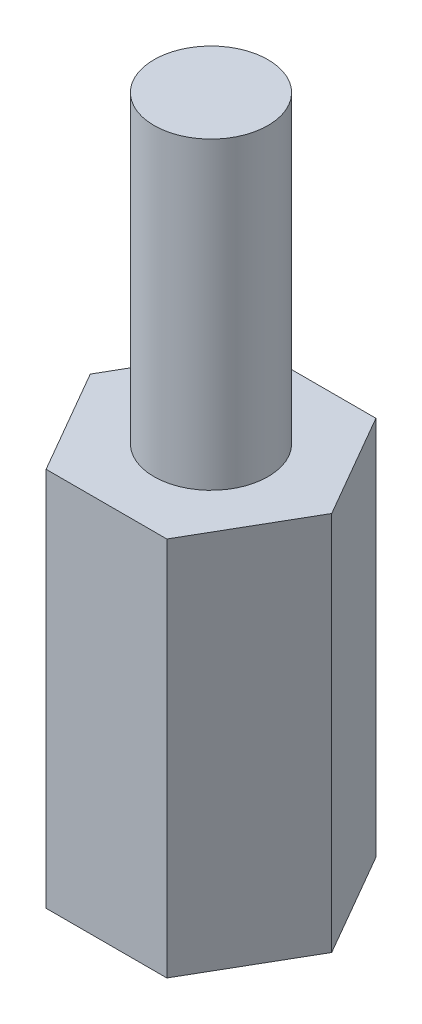
ISO-10303-21;
HEADER;
FILE_DESCRIPTION(('STEP AP214'),'2;1');
FILE_NAME('part.step','',(''),(''),'','','');
FILE_SCHEMA(('AUTOMOTIVE_DESIGN { 1 0 10303 214 1 1 1 1 }'));
ENDSEC;
DATA;
#1=APPLICATION_CONTEXT('core data for automotive mechanical design processes');
#2=APPLICATION_PROTOCOL_DEFINITION('international standard','automotive_design',2000,#1);
#3=PRODUCT_CONTEXT('',#1,'mechanical');
#4=PRODUCT('Part','Part','',(#3));
#5=PRODUCT_RELATED_PRODUCT_CATEGORY('part','',(#4));
#6=PRODUCT_DEFINITION_FORMATION('','',#4);
#7=PRODUCT_DEFINITION_CONTEXT('part definition',#1,'design');
#8=PRODUCT_DEFINITION('design','',#6,#7);
#9=PRODUCT_DEFINITION_SHAPE('','',#8);
#10=(LENGTH_UNIT() NAMED_UNIT(*) SI_UNIT(.MILLI.,.METRE.));
#11=(NAMED_UNIT(*) PLANE_ANGLE_UNIT() SI_UNIT($,.RADIAN.));
#12=(NAMED_UNIT(*) SI_UNIT($,.STERADIAN.) SOLID_ANGLE_UNIT());
#13=UNCERTAINTY_MEASURE_WITH_UNIT(LENGTH_MEASURE(1.E-05),#10,'distance_accuracy_value','');
#14=(GEOMETRIC_REPRESENTATION_CONTEXT(3) GLOBAL_UNCERTAINTY_ASSIGNED_CONTEXT((#13)) GLOBAL_UNIT_ASSIGNED_CONTEXT((#10,
#11,#12)) REPRESENTATION_CONTEXT('',''));
#15=CARTESIAN_POINT('',(0.,0.,0.));
#16=DIRECTION('',(0.,0.,1.));
#17=DIRECTION('',(1.,0.,0.));
#18=AXIS2_PLACEMENT_3D('',#15,#16,#17);
#19=CARTESIAN_POINT('',(1.5877132402715,-10.,2.74999999999998));
#20=DIRECTION('',(0.866025403784442,0.,0.499999999999995));
#21=DIRECTION('',(0.499999999999995,0.,-0.866025403784442));
#22=AXIS2_PLACEMENT_3D('',#19,#20,#21);
#23=PLANE('',#22);
#24=DIRECTION('',(0.499999999999995,0.,-0.866025403784441));
#25=VECTOR('',#24,1.);
#26=CARTESIAN_POINT('',(1.5877132402715,0.,2.74999999999998));
#27=LINE('',#26,#25);
#28=CARTESIAN_POINT('',(1.5877132402715,0.,2.74999999999998));
#29=VERTEX_POINT('',#28);
#30=CARTESIAN_POINT('',(3.17542648054294,0.,0.));
#31=VERTEX_POINT('',#30);
#32=EDGE_CURVE('E132',#29,#31,#27,.T.);
#33=ORIENTED_EDGE('',*,*,#32,.F.);
#34=DIRECTION('',(0.,1.,0.));
#35=VECTOR('',#34,1.);
#36=CARTESIAN_POINT('',(1.5877132402715,-10.,2.74999999999998));
#37=LINE('',#36,#35);
#38=CARTESIAN_POINT('',(1.5877132402715,-10.,2.74999999999998));
#39=VERTEX_POINT('',#38);
#40=EDGE_CURVE('E49',#39,#29,#37,.T.);
#41=ORIENTED_EDGE('',*,*,#40,.F.);
#42=DIRECTION('',(0.499999999999995,0.,-0.866025403784441));
#43=VECTOR('',#42,1.);
#44=CARTESIAN_POINT('',(1.5877132402715,-10.,2.74999999999998));
#45=LINE('',#44,#43);
#46=CARTESIAN_POINT('',(3.17542648054294,-10.,0.));
#47=VERTEX_POINT('',#46);
#48=EDGE_CURVE('E154',#39,#47,#45,.T.);
#49=ORIENTED_EDGE('',*,*,#48,.T.);
#50=DIRECTION('',(0.,1.,0.));
#51=VECTOR('',#50,1.);
#52=CARTESIAN_POINT('',(3.17542648054294,-10.,0.));
#53=LINE('',#52,#51);
#54=EDGE_CURVE('E42',#47,#31,#53,.T.);
#55=ORIENTED_EDGE('',*,*,#54,.T.);
#56=EDGE_LOOP('',(#33,#41,#49,#55));
#57=FACE_BOUND('',#56,.T.);
#58=ADVANCED_FACE('F39',(#57),#23,.T.);
#59=CARTESIAN_POINT('',(-1.58771324027145,-10.,2.75000000000002));
#60=DIRECTION('',(0.,0.,1.));
#61=DIRECTION('',(1.,0.,0.));
#62=AXIS2_PLACEMENT_3D('',#59,#60,#61);
#63=PLANE('',#62);
#64=DIRECTION('',(1.,0.,0.));
#65=VECTOR('',#64,1.);
#66=CARTESIAN_POINT('',(-1.58771324027145,0.,2.75000000000002));
#67=LINE('',#66,#65);
#68=CARTESIAN_POINT('',(-1.58771324027145,0.,2.75000000000002));
#69=VERTEX_POINT('',#68);
#70=EDGE_CURVE('E150',#69,#29,#67,.T.);
#71=ORIENTED_EDGE('',*,*,#70,.F.);
#72=DIRECTION('',(0.,1.,0.));
#73=VECTOR('',#72,1.);
#74=CARTESIAN_POINT('',(-1.58771324027145,-10.,2.75000000000002));
#75=LINE('',#74,#73);
#76=CARTESIAN_POINT('',(-1.58771324027145,-10.,2.75000000000002));
#77=VERTEX_POINT('',#76);
#78=EDGE_CURVE('E80',#77,#69,#75,.T.);
#79=ORIENTED_EDGE('',*,*,#78,.F.);
#80=DIRECTION('',(1.,0.,0.));
#81=VECTOR('',#80,1.);
#82=CARTESIAN_POINT('',(-1.58771324027145,-10.,2.75000000000002));
#83=LINE('',#82,#81);
#84=EDGE_CURVE('E118',#77,#39,#83,.T.);
#85=ORIENTED_EDGE('',*,*,#84,.T.);
#86=ORIENTED_EDGE('',*,*,#40,.T.);
#87=EDGE_LOOP('',(#71,#79,#85,#86));
#88=FACE_BOUND('',#87,.T.);
#89=ADVANCED_FACE('F167',(#88),#63,.T.);
#90=CARTESIAN_POINT('',(-3.17542648054294,-10.,0.));
#91=DIRECTION('',(-0.866025403784435,0.,0.500000000000007));
#92=DIRECTION('',(0.500000000000007,0.,0.866025403784435));
#93=AXIS2_PLACEMENT_3D('',#90,#91,#92);
#94=PLANE('',#93);
#95=DIRECTION('',(0.500000000000007,0.,0.866025403784435));
#96=VECTOR('',#95,1.);
#97=CARTESIAN_POINT('',(-3.17542648054294,0.,0.));
#98=LINE('',#97,#96);
#99=CARTESIAN_POINT('',(-3.17542648054294,0.,0.));
#100=VERTEX_POINT('',#99);
#101=EDGE_CURVE('E104',#100,#69,#98,.T.);
#102=ORIENTED_EDGE('',*,*,#101,.F.);
#103=DIRECTION('',(0.,1.,0.));
#104=VECTOR('',#103,1.);
#105=CARTESIAN_POINT('',(-3.17542648054294,-10.,0.));
#106=LINE('',#105,#104);
#107=CARTESIAN_POINT('',(-3.17542648054294,-10.,0.));
#108=VERTEX_POINT('',#107);
#109=EDGE_CURVE('E99',#108,#100,#106,.T.);
#110=ORIENTED_EDGE('',*,*,#109,.F.);
#111=DIRECTION('',(0.500000000000007,0.,0.866025403784435));
#112=VECTOR('',#111,1.);
#113=CARTESIAN_POINT('',(-3.17542648054294,-10.,0.));
#114=LINE('',#113,#112);
#115=EDGE_CURVE('E102',#108,#77,#114,.T.);
#116=ORIENTED_EDGE('',*,*,#115,.T.);
#117=ORIENTED_EDGE('',*,*,#78,.T.);
#118=EDGE_LOOP('',(#102,#110,#116,#117));
#119=FACE_BOUND('',#118,.T.);
#120=ADVANCED_FACE('F101',(#119),#94,.T.);
#121=CARTESIAN_POINT('',(-1.58771324027148,-10.,-2.74999999999999));
#122=DIRECTION('',(-0.866025403784442,0.,-0.499999999999995));
#123=DIRECTION('',(-0.499999999999995,0.,0.866025403784442));
#124=AXIS2_PLACEMENT_3D('',#121,#122,#123);
#125=PLANE('',#124);
#126=DIRECTION('',(-0.499999999999995,0.,0.866025403784442));
#127=VECTOR('',#126,1.);
#128=CARTESIAN_POINT('',(-1.58771324027148,0.,-2.74999999999999));
#129=LINE('',#128,#127);
#130=CARTESIAN_POINT('',(-1.58771324027148,0.,-2.74999999999999));
#131=VERTEX_POINT('',#130);
#132=EDGE_CURVE('E145',#131,#100,#129,.T.);
#133=ORIENTED_EDGE('',*,*,#132,.F.);
#134=DIRECTION('',(0.,1.,0.));
#135=VECTOR('',#134,1.);
#136=CARTESIAN_POINT('',(-1.58771324027148,-10.,-2.74999999999999));
#137=LINE('',#136,#135);
#138=CARTESIAN_POINT('',(-1.58771324027148,-10.,-2.74999999999999));
#139=VERTEX_POINT('',#138);
#140=EDGE_CURVE('E110',#139,#131,#137,.T.);
#141=ORIENTED_EDGE('',*,*,#140,.F.);
#142=DIRECTION('',(-0.499999999999995,0.,0.866025403784442));
#143=VECTOR('',#142,1.);
#144=CARTESIAN_POINT('',(-1.58771324027148,-10.,-2.74999999999999));
#145=LINE('',#144,#143);
#146=EDGE_CURVE('E116',#139,#108,#145,.T.);
#147=ORIENTED_EDGE('',*,*,#146,.T.);
#148=ORIENTED_EDGE('',*,*,#109,.T.);
#149=EDGE_LOOP('',(#133,#141,#147,#148));
#150=FACE_BOUND('',#149,.T.);
#151=ADVANCED_FACE('F121',(#150),#125,.T.);
#152=CARTESIAN_POINT('',(1.58771324027147,-10.,-2.75000000000001));
#153=DIRECTION('',(0.,0.,-1.));
#154=DIRECTION('',(-1.,0.,0.));
#155=AXIS2_PLACEMENT_3D('',#152,#153,#154);
#156=PLANE('',#155);
#157=DIRECTION('',(-1.,0.,0.));
#158=VECTOR('',#157,1.);
#159=CARTESIAN_POINT('',(1.58771324027147,0.,-2.75000000000001));
#160=LINE('',#159,#158);
#161=CARTESIAN_POINT('',(1.58771324027147,0.,-2.75000000000001));
#162=VERTEX_POINT('',#161);
#163=EDGE_CURVE('E141',#162,#131,#160,.T.);
#164=ORIENTED_EDGE('',*,*,#163,.F.);
#165=DIRECTION('',(0.,1.,0.));
#166=VECTOR('',#165,1.);
#167=CARTESIAN_POINT('',(1.58771324027147,-10.,-2.75000000000001));
#168=LINE('',#167,#166);
#169=CARTESIAN_POINT('',(1.58771324027147,-10.,-2.75000000000001));
#170=VERTEX_POINT('',#169);
#171=EDGE_CURVE('E160',#170,#162,#168,.T.);
#172=ORIENTED_EDGE('',*,*,#171,.F.);
#173=DIRECTION('',(-1.,0.,0.));
#174=VECTOR('',#173,1.);
#175=CARTESIAN_POINT('',(1.58771324027147,-10.,-2.75000000000001));
#176=LINE('',#175,#174);
#177=EDGE_CURVE('E123',#170,#139,#176,.T.);
#178=ORIENTED_EDGE('',*,*,#177,.T.);
#179=ORIENTED_EDGE('',*,*,#140,.T.);
#180=EDGE_LOOP('',(#164,#172,#178,#179));
#181=FACE_BOUND('',#180,.T.);
#182=ADVANCED_FACE('F180',(#181),#156,.T.);
#183=CARTESIAN_POINT('',(3.17542648054294,-10.,0.));
#184=DIRECTION('',(0.866025403784438,0.,-0.500000000000001));
#185=DIRECTION('',(-0.500000000000001,0.,-0.866025403784438));
#186=AXIS2_PLACEMENT_3D('',#183,#184,#185);
#187=PLANE('',#186);
#188=DIRECTION('',(-0.500000000000001,0.,-0.866025403784438));
#189=VECTOR('',#188,1.);
#190=CARTESIAN_POINT('',(3.17542648054294,0.,0.));
#191=LINE('',#190,#189);
#192=EDGE_CURVE('E136',#31,#162,#191,.T.);
#193=ORIENTED_EDGE('',*,*,#192,.F.);
#194=ORIENTED_EDGE('',*,*,#54,.F.);
#195=DIRECTION('',(-0.500000000000001,0.,-0.866025403784438));
#196=VECTOR('',#195,1.);
#197=CARTESIAN_POINT('',(3.17542648054294,-10.,0.));
#198=LINE('',#197,#196);
#199=EDGE_CURVE('E126',#47,#170,#198,.T.);
#200=ORIENTED_EDGE('',*,*,#199,.T.);
#201=ORIENTED_EDGE('',*,*,#171,.T.);
#202=EDGE_LOOP('',(#193,#194,#200,#201));
#203=FACE_BOUND('',#202,.T.);
#204=ADVANCED_FACE('F164',(#203),#187,.T.);
#205=CARTESIAN_POINT('',(0.,-10.,0.));
#206=DIRECTION('',(0.,1.,0.));
#207=DIRECTION('',(0.,0.,1.));
#208=AXIS2_PLACEMENT_3D('',#205,#206,#207);
#209=PLANE('',#208);
#210=ORIENTED_EDGE('',*,*,#48,.F.);
#211=ORIENTED_EDGE('',*,*,#84,.F.);
#212=ORIENTED_EDGE('',*,*,#115,.F.);
#213=ORIENTED_EDGE('',*,*,#146,.F.);
#214=ORIENTED_EDGE('',*,*,#177,.F.);
#215=ORIENTED_EDGE('',*,*,#199,.F.);
#216=EDGE_LOOP('',(#210,#211,#212,#213,#214,#215));
#217=FACE_BOUND('',#216,.T.);
#218=ADVANCED_FACE('F114',(#217),#209,.F.);
#219=CARTESIAN_POINT('',(0.,0.,0.));
#220=DIRECTION('',(0.,1.,0.));
#221=DIRECTION('',(0.,0.,1.));
#222=AXIS2_PLACEMENT_3D('',#219,#220,#221);
#223=PLANE('',#222);
#224=CARTESIAN_POINT('',(0.,0.,0.));
#225=DIRECTION('',(0.,1.,0.));
#226=DIRECTION('',(0.,0.,1.));
#227=AXIS2_PLACEMENT_3D('',#224,#225,#226);
#228=CIRCLE('',#227,1.5);
#229=CARTESIAN_POINT('',(0.,0.,1.5));
#230=VERTEX_POINT('',#229);
#231=EDGE_CURVE('E11',#230,#230,#228,.T.);
#232=ORIENTED_EDGE('',*,*,#231,.F.);
#233=EDGE_LOOP('',(#232));
#234=FACE_BOUND('',#233,.T.);
#235=ORIENTED_EDGE('',*,*,#32,.T.);
#236=ORIENTED_EDGE('',*,*,#192,.T.);
#237=ORIENTED_EDGE('',*,*,#163,.T.);
#238=ORIENTED_EDGE('',*,*,#132,.T.);
#239=ORIENTED_EDGE('',*,*,#101,.T.);
#240=ORIENTED_EDGE('',*,*,#70,.T.);
#241=EDGE_LOOP('',(#235,#236,#237,#238,#239,#240));
#242=FACE_BOUND('',#241,.T.);
#243=ADVANCED_FACE('F166',(#234,#242),#223,.T.);
#244=CARTESIAN_POINT('',(0.,8.,0.));
#245=DIRECTION('',(0.,-1.,0.));
#246=DIRECTION('',(0.,0.,-1.));
#247=AXIS2_PLACEMENT_3D('',#244,#245,#246);
#248=CYLINDRICAL_SURFACE('',#247,1.5);
#249=CARTESIAN_POINT('',(0.,8.,0.));
#250=DIRECTION('',(0.,1.,0.));
#251=DIRECTION('',(0.,0.,1.));
#252=AXIS2_PLACEMENT_3D('',#249,#250,#251);
#253=CIRCLE('',#252,1.5);
#254=CARTESIAN_POINT('',(0.,8.,1.5));
#255=VERTEX_POINT('',#254);
#256=EDGE_CURVE('E137',#255,#255,#253,.T.);
#257=ORIENTED_EDGE('',*,*,#256,.F.);
#258=EDGE_LOOP('',(#257));
#259=FACE_BOUND('',#258,.T.);
#260=ORIENTED_EDGE('',*,*,#231,.T.);
#261=EDGE_LOOP('',(#260));
#262=FACE_BOUND('',#261,.T.);
#263=ADVANCED_FACE('F190',(#259,#262),#248,.T.);
#264=CARTESIAN_POINT('',(0.,8.,0.));
#265=DIRECTION('',(0.,1.,0.));
#266=DIRECTION('',(0.,0.,1.));
#267=AXIS2_PLACEMENT_3D('',#264,#265,#266);
#268=PLANE('',#267);
#269=ORIENTED_EDGE('',*,*,#256,.T.);
#270=EDGE_LOOP('',(#269));
#271=FACE_BOUND('',#270,.T.);
#272=ADVANCED_FACE('F195',(#271),#268,.T.);
#273=CLOSED_SHELL('',(#58,#89,#120,#151,#182,#204,#218,#243,#263,#272));
#274=MANIFOLD_SOLID_BREP('B2',#273);
#275=ADVANCED_BREP_SHAPE_REPRESENTATION('',(#18,#274),#14);
#276=SHAPE_DEFINITION_REPRESENTATION(#9,#275);
ENDSEC;
END-ISO-10303-21;
